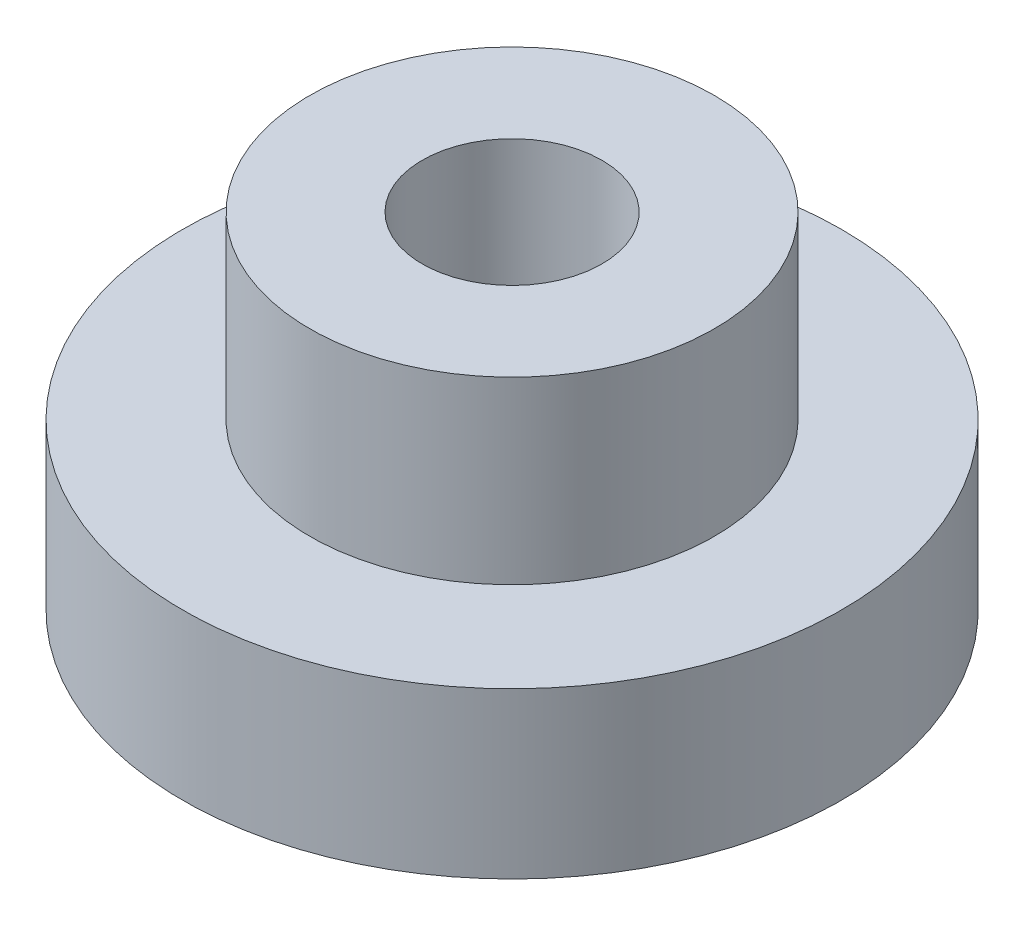
ISO-10303-21;
HEADER;
FILE_DESCRIPTION(('STEP AP214'),'2;1');
FILE_NAME('part.step','',(''),(''),'','','');
FILE_SCHEMA(('AUTOMOTIVE_DESIGN { 1 0 10303 214 1 1 1 1 }'));
ENDSEC;
DATA;
#1=APPLICATION_CONTEXT('core data for automotive mechanical design processes');
#2=APPLICATION_PROTOCOL_DEFINITION('international standard','automotive_design',2000,#1);
#3=PRODUCT_CONTEXT('',#1,'mechanical');
#4=PRODUCT('Part','Part','',(#3));
#5=PRODUCT_RELATED_PRODUCT_CATEGORY('part','',(#4));
#6=PRODUCT_DEFINITION_FORMATION('','',#4);
#7=PRODUCT_DEFINITION_CONTEXT('part definition',#1,'design');
#8=PRODUCT_DEFINITION('design','',#6,#7);
#9=PRODUCT_DEFINITION_SHAPE('','',#8);
#10=(LENGTH_UNIT() NAMED_UNIT(*) SI_UNIT(.MILLI.,.METRE.));
#11=(NAMED_UNIT(*) PLANE_ANGLE_UNIT() SI_UNIT($,.RADIAN.));
#12=(NAMED_UNIT(*) SI_UNIT($,.STERADIAN.) SOLID_ANGLE_UNIT());
#13=UNCERTAINTY_MEASURE_WITH_UNIT(LENGTH_MEASURE(1.E-05),#10,'distance_accuracy_value','');
#14=(GEOMETRIC_REPRESENTATION_CONTEXT(3) GLOBAL_UNCERTAINTY_ASSIGNED_CONTEXT((#13)) GLOBAL_UNIT_ASSIGNED_CONTEXT((#10,
#11,#12)) REPRESENTATION_CONTEXT('',''));
#15=CARTESIAN_POINT('',(0.,0.,0.));
#16=DIRECTION('',(0.,0.,1.));
#17=DIRECTION('',(1.,0.,0.));
#18=AXIS2_PLACEMENT_3D('',#15,#16,#17);
#19=CARTESIAN_POINT('',(13.5,23.,0.));
#20=DIRECTION('',(0.,1.,0.));
#21=DIRECTION('',(0.,0.,1.));
#22=AXIS2_PLACEMENT_3D('',#19,#20,#21);
#23=PLANE('',#22);
#24=CARTESIAN_POINT('',(0.,23.,0.));
#25=DIRECTION('',(0.,-1.,0.));
#26=DIRECTION('',(0.,0.,-1.));
#27=AXIS2_PLACEMENT_3D('',#24,#25,#26);
#28=CIRCLE('',#27,6.);
#29=CARTESIAN_POINT('',(0.,23.,-6.));
#30=VERTEX_POINT('',#29);
#31=EDGE_CURVE('E10',#30,#30,#28,.T.);
#32=ORIENTED_EDGE('',*,*,#31,.T.);
#33=EDGE_LOOP('',(#32));
#34=FACE_BOUND('',#33,.T.);
#35=CARTESIAN_POINT('',(0.,23.,0.));
#36=DIRECTION('',(0.,-1.,0.));
#37=DIRECTION('',(0.,0.,-1.));
#38=AXIS2_PLACEMENT_3D('',#35,#36,#37);
#39=CIRCLE('',#38,13.5);
#40=CARTESIAN_POINT('',(0.,23.,-13.5));
#41=VERTEX_POINT('',#40);
#42=EDGE_CURVE('E64',#41,#41,#39,.T.);
#43=ORIENTED_EDGE('',*,*,#42,.F.);
#44=EDGE_LOOP('',(#43));
#45=FACE_BOUND('',#44,.T.);
#46=ADVANCED_FACE('F37',(#34,#45),#23,.T.);
#47=CARTESIAN_POINT('',(0.,0.,0.));
#48=DIRECTION('',(0.,-1.,0.));
#49=DIRECTION('',(0.,0.,-1.));
#50=AXIS2_PLACEMENT_3D('',#47,#48,#49);
#51=CYLINDRICAL_SURFACE('',#50,6.);
#52=CARTESIAN_POINT('',(0.,0.,0.));
#53=DIRECTION('',(0.,-1.,0.));
#54=DIRECTION('',(0.,0.,-1.));
#55=AXIS2_PLACEMENT_3D('',#52,#53,#54);
#56=CIRCLE('',#55,6.);
#57=CARTESIAN_POINT('',(0.,0.,-6.));
#58=VERTEX_POINT('',#57);
#59=EDGE_CURVE('E44',#58,#58,#56,.T.);
#60=ORIENTED_EDGE('',*,*,#59,.T.);
#61=EDGE_LOOP('',(#60));
#62=FACE_BOUND('',#61,.T.);
#63=ORIENTED_EDGE('',*,*,#31,.F.);
#64=EDGE_LOOP('',(#63));
#65=FACE_BOUND('',#64,.T.);
#66=ADVANCED_FACE('F73',(#62,#65),#51,.F.);
#67=CARTESIAN_POINT('',(6.,0.,0.));
#68=DIRECTION('',(0.,-1.,0.));
#69=DIRECTION('',(0.,0.,-1.));
#70=AXIS2_PLACEMENT_3D('',#67,#68,#69);
#71=PLANE('',#70);
#72=CARTESIAN_POINT('',(0.,0.,0.));
#73=DIRECTION('',(0.,-1.,0.));
#74=DIRECTION('',(0.,0.,-1.));
#75=AXIS2_PLACEMENT_3D('',#72,#73,#74);
#76=CIRCLE('',#75,22.);
#77=CARTESIAN_POINT('',(0.,0.,-22.));
#78=VERTEX_POINT('',#77);
#79=EDGE_CURVE('E49',#78,#78,#76,.T.);
#80=ORIENTED_EDGE('',*,*,#79,.T.);
#81=EDGE_LOOP('',(#80));
#82=FACE_BOUND('',#81,.T.);
#83=ORIENTED_EDGE('',*,*,#59,.F.);
#84=EDGE_LOOP('',(#83));
#85=FACE_BOUND('',#84,.T.);
#86=ADVANCED_FACE('F77',(#82,#85),#71,.T.);
#87=CARTESIAN_POINT('',(0.,0.,0.));
#88=DIRECTION('',(0.,-1.,0.));
#89=DIRECTION('',(0.,0.,-1.));
#90=AXIS2_PLACEMENT_3D('',#87,#88,#89);
#91=CYLINDRICAL_SURFACE('',#90,22.);
#92=CARTESIAN_POINT('',(0.,11.,0.));
#93=DIRECTION('',(0.,-1.,0.));
#94=DIRECTION('',(0.,0.,-1.));
#95=AXIS2_PLACEMENT_3D('',#92,#93,#94);
#96=CIRCLE('',#95,22.);
#97=CARTESIAN_POINT('',(0.,11.,-22.));
#98=VERTEX_POINT('',#97);
#99=EDGE_CURVE('E54',#98,#98,#96,.T.);
#100=ORIENTED_EDGE('',*,*,#99,.T.);
#101=EDGE_LOOP('',(#100));
#102=FACE_BOUND('',#101,.T.);
#103=ORIENTED_EDGE('',*,*,#79,.F.);
#104=EDGE_LOOP('',(#103));
#105=FACE_BOUND('',#104,.T.);
#106=ADVANCED_FACE('F81',(#102,#105),#91,.T.);
#107=CARTESIAN_POINT('',(22.,11.,0.));
#108=DIRECTION('',(0.,1.,0.));
#109=DIRECTION('',(0.,0.,1.));
#110=AXIS2_PLACEMENT_3D('',#107,#108,#109);
#111=PLANE('',#110);
#112=CARTESIAN_POINT('',(0.,11.,0.));
#113=DIRECTION('',(0.,-1.,0.));
#114=DIRECTION('',(0.,0.,-1.));
#115=AXIS2_PLACEMENT_3D('',#112,#113,#114);
#116=CIRCLE('',#115,13.5);
#117=CARTESIAN_POINT('',(0.,11.,-13.5));
#118=VERTEX_POINT('',#117);
#119=EDGE_CURVE('E60',#118,#118,#116,.T.);
#120=ORIENTED_EDGE('',*,*,#119,.T.);
#121=EDGE_LOOP('',(#120));
#122=FACE_BOUND('',#121,.T.);
#123=ORIENTED_EDGE('',*,*,#99,.F.);
#124=EDGE_LOOP('',(#123));
#125=FACE_BOUND('',#124,.T.);
#126=ADVANCED_FACE('F88',(#122,#125),#111,.T.);
#127=CARTESIAN_POINT('',(0.,0.,0.));
#128=DIRECTION('',(0.,-1.,0.));
#129=DIRECTION('',(0.,0.,-1.));
#130=AXIS2_PLACEMENT_3D('',#127,#128,#129);
#131=CYLINDRICAL_SURFACE('',#130,13.5);
#132=ORIENTED_EDGE('',*,*,#42,.T.);
#133=EDGE_LOOP('',(#132));
#134=FACE_BOUND('',#133,.T.);
#135=ORIENTED_EDGE('',*,*,#119,.F.);
#136=EDGE_LOOP('',(#135));
#137=FACE_BOUND('',#136,.T.);
#138=ADVANCED_FACE('F69',(#134,#137),#131,.T.);
#139=CLOSED_SHELL('',(#46,#66,#86,#106,#126,#138));
#140=MANIFOLD_SOLID_BREP('B2',#139);
#141=ADVANCED_BREP_SHAPE_REPRESENTATION('',(#18,#140),#14);
#142=SHAPE_DEFINITION_REPRESENTATION(#9,#141);
ENDSEC;
END-ISO-10303-21;
